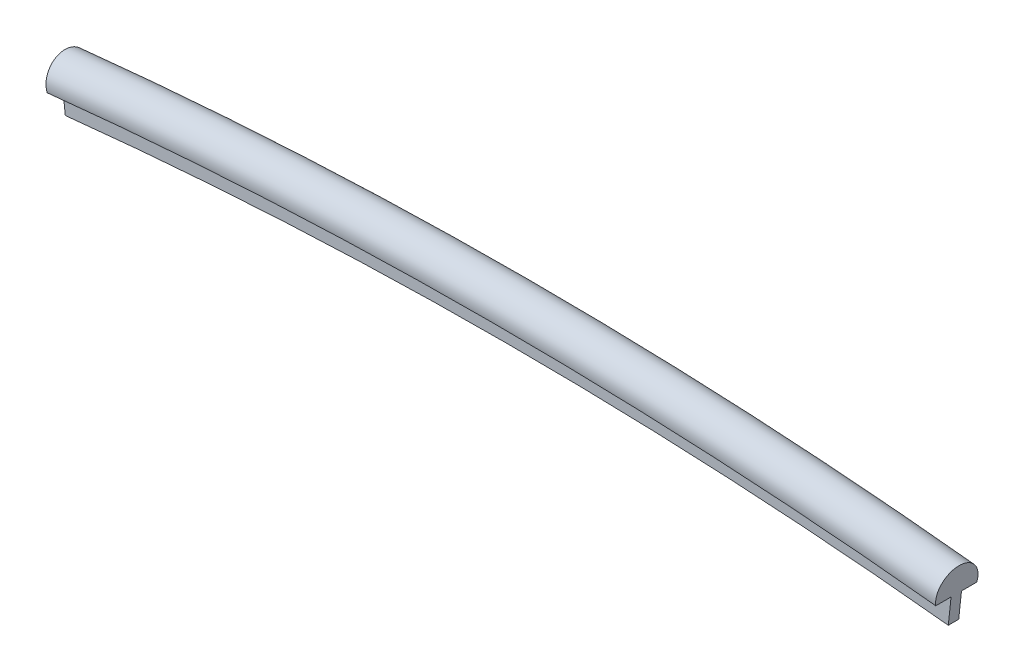
ISO-10303-21;
HEADER;
FILE_DESCRIPTION(('STEP AP214'),'2;1');
FILE_NAME('part.step','',(''),(''),'','','');
FILE_SCHEMA(('AUTOMOTIVE_DESIGN { 1 0 10303 214 1 1 1 1 }'));
ENDSEC;
DATA;
#1=APPLICATION_CONTEXT('core data for automotive mechanical design processes');
#2=APPLICATION_PROTOCOL_DEFINITION('international standard','automotive_design',2000,#1);
#3=PRODUCT_CONTEXT('',#1,'mechanical');
#4=PRODUCT('Part','Part','',(#3));
#5=PRODUCT_RELATED_PRODUCT_CATEGORY('part','',(#4));
#6=PRODUCT_DEFINITION_FORMATION('','',#4);
#7=PRODUCT_DEFINITION_CONTEXT('part definition',#1,'design');
#8=PRODUCT_DEFINITION('design','',#6,#7);
#9=PRODUCT_DEFINITION_SHAPE('','',#8);
#10=(LENGTH_UNIT() NAMED_UNIT(*) SI_UNIT(.MILLI.,.METRE.));
#11=(NAMED_UNIT(*) PLANE_ANGLE_UNIT() SI_UNIT($,.RADIAN.));
#12=(NAMED_UNIT(*) SI_UNIT($,.STERADIAN.) SOLID_ANGLE_UNIT());
#13=UNCERTAINTY_MEASURE_WITH_UNIT(LENGTH_MEASURE(1.E-05),#10,'distance_accuracy_value','');
#14=(GEOMETRIC_REPRESENTATION_CONTEXT(3) GLOBAL_UNCERTAINTY_ASSIGNED_CONTEXT((#13)) GLOBAL_UNIT_ASSIGNED_CONTEXT((#10,
#11,#12)) REPRESENTATION_CONTEXT('',''));
#15=CARTESIAN_POINT('',(0.,0.,0.));
#16=DIRECTION('',(0.,0.,1.));
#17=DIRECTION('',(1.,0.,0.));
#18=AXIS2_PLACEMENT_3D('',#15,#16,#17);
#19=CARTESIAN_POINT('',(0.,0.,70.5976415970385));
#20=DIRECTION('',(0.,0.,1.));
#21=DIRECTION('',(1.,0.,0.));
#22=AXIS2_PLACEMENT_3D('',#19,#20,#21);
#23=CYLINDRICAL_SURFACE('',#22,241.3);
#24=CARTESIAN_POINT('',(0.,0.,1.18));
#25=DIRECTION('',(0.,0.,1.));
#26=DIRECTION('',(1.,0.,0.));
#27=AXIS2_PLACEMENT_3D('',#24,#25,#26);
#28=CIRCLE('',#27,241.3);
#29=CARTESIAN_POINT('',(25.5719124770966,239.941174649671,1.18));
#30=VERTEX_POINT('',#29);
#31=CARTESIAN_POINT('',(-25.5719124770966,239.941174649671,1.18));
#32=VERTEX_POINT('',#31);
#33=EDGE_CURVE('E11',#30,#32,#28,.T.);
#34=ORIENTED_EDGE('',*,*,#33,.T.);
#35=DIRECTION('',(0.,0.,-1.));
#36=VECTOR('',#35,1.);
#37=CARTESIAN_POINT('',(-25.5719124770966,239.941174649671,1.18));
#38=LINE('',#37,#36);
#39=CARTESIAN_POINT('',(-25.5719124770966,239.941174649671,0.3));
#40=VERTEX_POINT('',#39);
#41=EDGE_CURVE('E103',#32,#40,#38,.T.);
#42=ORIENTED_EDGE('',*,*,#41,.T.);
#43=CARTESIAN_POINT('',(0.,0.,0.299999999999995));
#44=DIRECTION('',(0.,0.,1.));
#45=DIRECTION('',(1.,0.,0.));
#46=AXIS2_PLACEMENT_3D('',#43,#44,#45);
#47=CIRCLE('',#46,241.3);
#48=CARTESIAN_POINT('',(25.5719124770966,239.941174649671,0.3));
#49=VERTEX_POINT('',#48);
#50=EDGE_CURVE('E85',#49,#40,#47,.T.);
#51=ORIENTED_EDGE('',*,*,#50,.F.);
#52=DIRECTION('',(0.,0.,-1.));
#53=VECTOR('',#52,1.);
#54=CARTESIAN_POINT('',(25.5719124770966,239.941174649671,1.18));
#55=LINE('',#54,#53);
#56=EDGE_CURVE('E117',#30,#49,#55,.T.);
#57=ORIENTED_EDGE('',*,*,#56,.F.);
#58=EDGE_LOOP('',(#34,#42,#51,#57));
#59=FACE_BOUND('',#58,.T.);
#60=ADVANCED_FACE('F33',(#59),#23,.F.);
#61=CARTESIAN_POINT('',(0.,0.,0.));
#62=DIRECTION('',(0.,0.,1.));
#63=DIRECTION('',(1.,0.,0.));
#64=AXIS2_PLACEMENT_3D('',#61,#62,#63);
#65=TOROIDAL_SURFACE('',#64,241.586013989906,1.21416802890791);
#66=CARTESIAN_POINT('',(0.,0.,-1.18));
#67=DIRECTION('',(0.,0.,1.));
#68=DIRECTION('',(1.,0.,0.));
#69=AXIS2_PLACEMENT_3D('',#66,#67,#68);
#70=CIRCLE('',#69,241.3);
#71=CARTESIAN_POINT('',(25.5719124770966,239.941174649671,-1.18));
#72=VERTEX_POINT('',#71);
#73=CARTESIAN_POINT('',(-25.5719124770966,239.941174649671,-1.18));
#74=VERTEX_POINT('',#73);
#75=EDGE_CURVE('E41',#72,#74,#70,.T.);
#76=ORIENTED_EDGE('',*,*,#75,.T.);
#77=CARTESIAN_POINT('',(-25.602222981519,240.225578017695,0.));
#78=DIRECTION('',(0.994368730417201,0.105975600816812,0.));
#79=DIRECTION('',(0.,0.,1.));
#80=AXIS2_PLACEMENT_3D('',#77,#78,#79);
#81=CIRCLE('',#80,1.21416802890791);
#82=EDGE_CURVE('E115',#74,#32,#81,.T.);
#83=ORIENTED_EDGE('',*,*,#82,.T.);
#84=ORIENTED_EDGE('',*,*,#33,.F.);
#85=CARTESIAN_POINT('',(25.602222981519,240.225578017695,0.));
#86=DIRECTION('',(0.994368730417201,-0.105975600816812,0.));
#87=DIRECTION('',(0.,0.,1.));
#88=AXIS2_PLACEMENT_3D('',#85,#86,#87);
#89=CIRCLE('',#88,1.21416802890791);
#90=EDGE_CURVE('E97',#72,#30,#89,.T.);
#91=ORIENTED_EDGE('',*,*,#90,.F.);
#92=EDGE_LOOP('',(#76,#83,#84,#91));
#93=FACE_BOUND('',#92,.T.);
#94=ADVANCED_FACE('F35',(#93),#65,.T.);
#95=CARTESIAN_POINT('',(0.,0.,70.5976415970385));
#96=DIRECTION('',(0.,0.,1.));
#97=DIRECTION('',(1.,0.,0.));
#98=AXIS2_PLACEMENT_3D('',#95,#96,#97);
#99=CYLINDRICAL_SURFACE('',#98,241.3);
#100=CARTESIAN_POINT('',(0.,0.,-0.299999999999995));
#101=DIRECTION('',(0.,0.,1.));
#102=DIRECTION('',(1.,0.,0.));
#103=AXIS2_PLACEMENT_3D('',#100,#101,#102);
#104=CIRCLE('',#103,241.3);
#105=CARTESIAN_POINT('',(25.5719124770966,239.941174649671,-0.3));
#106=VERTEX_POINT('',#105);
#107=CARTESIAN_POINT('',(-25.5719124770966,239.941174649671,-0.3));
#108=VERTEX_POINT('',#107);
#109=EDGE_CURVE('E132',#106,#108,#104,.T.);
#110=ORIENTED_EDGE('',*,*,#109,.T.);
#111=DIRECTION('',(0.,0.,-1.));
#112=VECTOR('',#111,1.);
#113=CARTESIAN_POINT('',(-25.5719124770966,239.941174649671,-0.3));
#114=LINE('',#113,#112);
#115=EDGE_CURVE('E113',#108,#74,#114,.T.);
#116=ORIENTED_EDGE('',*,*,#115,.T.);
#117=ORIENTED_EDGE('',*,*,#75,.F.);
#118=DIRECTION('',(0.,0.,-1.));
#119=VECTOR('',#118,1.);
#120=CARTESIAN_POINT('',(25.5719124770966,239.941174649671,-0.3));
#121=LINE('',#120,#119);
#122=EDGE_CURVE('E125',#106,#72,#121,.T.);
#123=ORIENTED_EDGE('',*,*,#122,.F.);
#124=EDGE_LOOP('',(#110,#116,#117,#123));
#125=FACE_BOUND('',#124,.T.);
#126=ADVANCED_FACE('F134',(#125),#99,.F.);
#127=CARTESIAN_POINT('',(25.4129490758714,238.449621554045,-0.3));
#128=DIRECTION('',(0.,0.,1.));
#129=DIRECTION('',(1.,0.,0.));
#130=AXIS2_PLACEMENT_3D('',#127,#128,#129);
#131=PLANE('',#130);
#132=CARTESIAN_POINT('',(0.,0.,-0.299999999999995));
#133=DIRECTION('',(0.,0.,1.));
#134=DIRECTION('',(1.,0.,0.));
#135=AXIS2_PLACEMENT_3D('',#132,#133,#134);
#136=CIRCLE('',#135,239.8);
#137=CARTESIAN_POINT('',(25.4129490758714,238.449621554045,-0.3));
#138=VERTEX_POINT('',#137);
#139=CARTESIAN_POINT('',(-25.4129490758714,238.449621554045,-0.3));
#140=VERTEX_POINT('',#139);
#141=EDGE_CURVE('E129',#138,#140,#136,.T.);
#142=ORIENTED_EDGE('',*,*,#141,.T.);
#143=DIRECTION('',(-0.105975600816812,0.994368730417201,0.));
#144=VECTOR('',#143,1.);
#145=CARTESIAN_POINT('',(-25.4129490758714,238.449621554045,-0.3));
#146=LINE('',#145,#144);
#147=EDGE_CURVE('E110',#140,#108,#146,.T.);
#148=ORIENTED_EDGE('',*,*,#147,.T.);
#149=ORIENTED_EDGE('',*,*,#109,.F.);
#150=DIRECTION('',(0.105975600816812,0.994368730417201,0.));
#151=VECTOR('',#150,1.);
#152=CARTESIAN_POINT('',(25.4129490758714,238.449621554045,-0.3));
#153=LINE('',#152,#151);
#154=EDGE_CURVE('E122',#138,#106,#153,.T.);
#155=ORIENTED_EDGE('',*,*,#154,.F.);
#156=EDGE_LOOP('',(#142,#148,#149,#155));
#157=FACE_BOUND('',#156,.T.);
#158=ADVANCED_FACE('F136',(#157),#131,.F.);
#159=CARTESIAN_POINT('',(0.,0.,70.5976415970385));
#160=DIRECTION('',(0.,0.,1.));
#161=DIRECTION('',(1.,0.,0.));
#162=AXIS2_PLACEMENT_3D('',#159,#160,#161);
#163=CYLINDRICAL_SURFACE('',#162,239.8);
#164=CARTESIAN_POINT('',(0.,0.,0.299999999999995));
#165=DIRECTION('',(0.,0.,1.));
#166=DIRECTION('',(1.,0.,0.));
#167=AXIS2_PLACEMENT_3D('',#164,#165,#166);
#168=CIRCLE('',#167,239.8);
#169=CARTESIAN_POINT('',(25.4129490758714,238.449621554045,0.3));
#170=VERTEX_POINT('',#169);
#171=CARTESIAN_POINT('',(-25.4129490758714,238.449621554045,0.3));
#172=VERTEX_POINT('',#171);
#173=EDGE_CURVE('E96',#170,#172,#168,.T.);
#174=ORIENTED_EDGE('',*,*,#173,.T.);
#175=DIRECTION('',(0.,0.,-1.));
#176=VECTOR('',#175,1.);
#177=CARTESIAN_POINT('',(-25.4129490758714,238.449621554045,0.));
#178=LINE('',#177,#176);
#179=EDGE_CURVE('E105',#172,#140,#178,.T.);
#180=ORIENTED_EDGE('',*,*,#179,.T.);
#181=ORIENTED_EDGE('',*,*,#141,.F.);
#182=DIRECTION('',(0.,0.,-1.));
#183=VECTOR('',#182,1.);
#184=CARTESIAN_POINT('',(25.4129490758714,238.449621554045,0.));
#185=LINE('',#184,#183);
#186=EDGE_CURVE('E120',#170,#138,#185,.T.);
#187=ORIENTED_EDGE('',*,*,#186,.F.);
#188=EDGE_LOOP('',(#174,#180,#181,#187));
#189=FACE_BOUND('',#188,.T.);
#190=ADVANCED_FACE('F141',(#189),#163,.F.);
#191=CARTESIAN_POINT('',(25.4129490758714,238.449621554045,0.3));
#192=DIRECTION('',(0.,0.,-1.));
#193=DIRECTION('',(-1.,0.,0.));
#194=AXIS2_PLACEMENT_3D('',#191,#192,#193);
#195=PLANE('',#194);
#196=DIRECTION('',(-0.105975600816812,-0.994368730417201,0.));
#197=VECTOR('',#196,1.);
#198=CARTESIAN_POINT('',(25.4129490758714,238.449621554045,0.3));
#199=LINE('',#198,#197);
#200=EDGE_CURVE('E91',#49,#170,#199,.T.);
#201=ORIENTED_EDGE('',*,*,#200,.F.);
#202=ORIENTED_EDGE('',*,*,#50,.T.);
#203=DIRECTION('',(0.105975600816812,-0.994368730417201,0.));
#204=VECTOR('',#203,1.);
#205=CARTESIAN_POINT('',(-25.4129490758714,238.449621554045,0.3));
#206=LINE('',#205,#204);
#207=EDGE_CURVE('E88',#40,#172,#206,.T.);
#208=ORIENTED_EDGE('',*,*,#207,.T.);
#209=ORIENTED_EDGE('',*,*,#173,.F.);
#210=EDGE_LOOP('',(#201,#202,#208,#209));
#211=FACE_BOUND('',#210,.T.);
#212=ADVANCED_FACE('F87',(#211),#195,.F.);
#213=CARTESIAN_POINT('',(25.602222981519,240.225578017695,0.));
#214=DIRECTION('',(-0.994368730417201,0.105975600816812,0.));
#215=DIRECTION('',(0.,0.,1.));
#216=AXIS2_PLACEMENT_3D('',#213,#214,#215);
#217=PLANE('',#216);
#218=ORIENTED_EDGE('',*,*,#56,.T.);
#219=ORIENTED_EDGE('',*,*,#200,.T.);
#220=ORIENTED_EDGE('',*,*,#186,.T.);
#221=ORIENTED_EDGE('',*,*,#154,.T.);
#222=ORIENTED_EDGE('',*,*,#122,.T.);
#223=ORIENTED_EDGE('',*,*,#90,.T.);
#224=EDGE_LOOP('',(#218,#219,#220,#221,#222,#223));
#225=FACE_BOUND('',#224,.T.);
#226=ADVANCED_FACE('F143',(#225),#217,.F.);
#227=CARTESIAN_POINT('',(-25.602222981519,240.225578017695,0.));
#228=DIRECTION('',(-0.994368730417201,-0.105975600816812,0.));
#229=DIRECTION('',(0.,0.,1.));
#230=AXIS2_PLACEMENT_3D('',#227,#228,#229);
#231=PLANE('',#230);
#232=ORIENTED_EDGE('',*,*,#41,.F.);
#233=ORIENTED_EDGE('',*,*,#82,.F.);
#234=ORIENTED_EDGE('',*,*,#115,.F.);
#235=ORIENTED_EDGE('',*,*,#147,.F.);
#236=ORIENTED_EDGE('',*,*,#179,.F.);
#237=ORIENTED_EDGE('',*,*,#207,.F.);
#238=EDGE_LOOP('',(#232,#233,#234,#235,#236,#237));
#239=FACE_BOUND('',#238,.T.);
#240=ADVANCED_FACE('F101',(#239),#231,.T.);
#241=CLOSED_SHELL('',(#60,#94,#126,#158,#190,#212,#226,#240));
#242=MANIFOLD_SOLID_BREP('B2',#241);
#243=ADVANCED_BREP_SHAPE_REPRESENTATION('',(#18,#242),#14);
#244=SHAPE_DEFINITION_REPRESENTATION(#9,#243);
ENDSEC;
END-ISO-10303-21;
